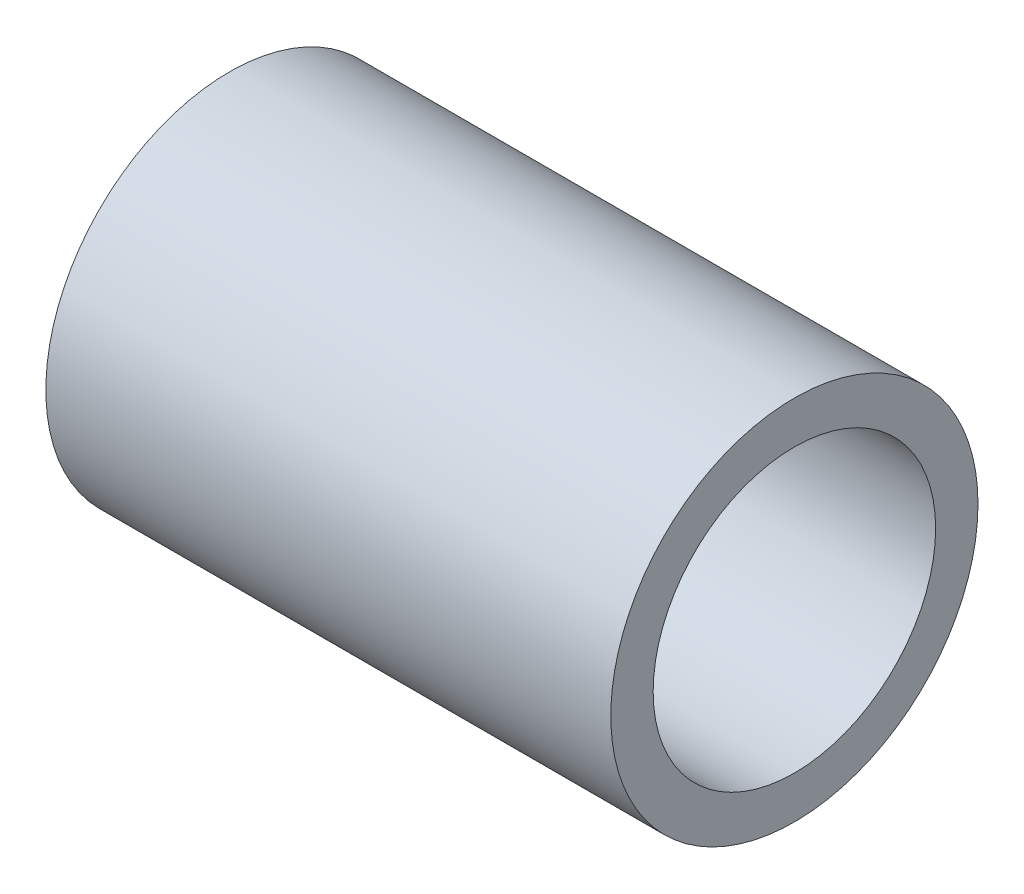
ISO-10303-21;
HEADER;
FILE_DESCRIPTION(('STEP AP214'),'2;1');
FILE_NAME('part.step','',(''),(''),'','','');
FILE_SCHEMA(('AUTOMOTIVE_DESIGN { 1 0 10303 214 1 1 1 1 }'));
ENDSEC;
DATA;
#1=APPLICATION_CONTEXT('core data for automotive mechanical design processes');
#2=APPLICATION_PROTOCOL_DEFINITION('international standard','automotive_design',2000,#1);
#3=PRODUCT_CONTEXT('',#1,'mechanical');
#4=PRODUCT('Part','Part','',(#3));
#5=PRODUCT_RELATED_PRODUCT_CATEGORY('part','',(#4));
#6=PRODUCT_DEFINITION_FORMATION('','',#4);
#7=PRODUCT_DEFINITION_CONTEXT('part definition',#1,'design');
#8=PRODUCT_DEFINITION('design','',#6,#7);
#9=PRODUCT_DEFINITION_SHAPE('','',#8);
#10=(LENGTH_UNIT() NAMED_UNIT(*) SI_UNIT(.MILLI.,.METRE.));
#11=(NAMED_UNIT(*) PLANE_ANGLE_UNIT() SI_UNIT($,.RADIAN.));
#12=(NAMED_UNIT(*) SI_UNIT($,.STERADIAN.) SOLID_ANGLE_UNIT());
#13=UNCERTAINTY_MEASURE_WITH_UNIT(LENGTH_MEASURE(1.E-05),#10,'distance_accuracy_value','');
#14=(GEOMETRIC_REPRESENTATION_CONTEXT(3) GLOBAL_UNCERTAINTY_ASSIGNED_CONTEXT((#13)) GLOBAL_UNIT_ASSIGNED_CONTEXT((#10,
#11,#12)) REPRESENTATION_CONTEXT('',''));
#15=CARTESIAN_POINT('',(0.,0.,0.));
#16=DIRECTION('',(0.,0.,1.));
#17=DIRECTION('',(1.,0.,0.));
#18=AXIS2_PLACEMENT_3D('',#15,#16,#17);
#19=CARTESIAN_POINT('',(20.,0.,0.));
#20=DIRECTION('',(1.,0.,0.));
#21=DIRECTION('',(0.,0.,-1.));
#22=AXIS2_PLACEMENT_3D('',#19,#20,#21);
#23=PLANE('',#22);
#24=CARTESIAN_POINT('',(20.,0.,0.));
#25=DIRECTION('',(1.,0.,0.));
#26=DIRECTION('',(0.,0.,-1.));
#27=AXIS2_PLACEMENT_3D('',#24,#25,#26);
#28=CIRCLE('',#27,6.5);
#29=CARTESIAN_POINT('',(20.,0.,-6.5));
#30=VERTEX_POINT('',#29);
#31=EDGE_CURVE('E10',#30,#30,#28,.T.);
#32=ORIENTED_EDGE('',*,*,#31,.T.);
#33=EDGE_LOOP('',(#32));
#34=FACE_BOUND('',#33,.T.);
#35=CARTESIAN_POINT('',(20.,0.,0.));
#36=DIRECTION('',(1.,0.,0.));
#37=DIRECTION('',(0.,0.,-1.));
#38=AXIS2_PLACEMENT_3D('',#35,#36,#37);
#39=CIRCLE('',#38,5.);
#40=CARTESIAN_POINT('',(20.,0.,-5.));
#41=VERTEX_POINT('',#40);
#42=EDGE_CURVE('E50',#41,#41,#39,.T.);
#43=ORIENTED_EDGE('',*,*,#42,.F.);
#44=EDGE_LOOP('',(#43));
#45=FACE_BOUND('',#44,.T.);
#46=ADVANCED_FACE('F38',(#34,#45),#23,.T.);
#47=CARTESIAN_POINT('',(0.,0.,0.));
#48=DIRECTION('',(1.,0.,0.));
#49=DIRECTION('',(0.,0.,-1.));
#50=AXIS2_PLACEMENT_3D('',#47,#48,#49);
#51=PLANE('',#50);
#52=CARTESIAN_POINT('',(0.,0.,0.));
#53=DIRECTION('',(1.,0.,0.));
#54=DIRECTION('',(0.,0.,-1.));
#55=AXIS2_PLACEMENT_3D('',#52,#53,#54);
#56=CIRCLE('',#55,6.5);
#57=CARTESIAN_POINT('',(0.,0.,-6.5));
#58=VERTEX_POINT('',#57);
#59=EDGE_CURVE('E37',#58,#58,#56,.T.);
#60=ORIENTED_EDGE('',*,*,#59,.F.);
#61=EDGE_LOOP('',(#60));
#62=FACE_BOUND('',#61,.T.);
#63=CARTESIAN_POINT('',(0.,0.,0.));
#64=DIRECTION('',(1.,0.,0.));
#65=DIRECTION('',(0.,0.,-1.));
#66=AXIS2_PLACEMENT_3D('',#63,#64,#65);
#67=CIRCLE('',#66,5.);
#68=CARTESIAN_POINT('',(0.,0.,-5.));
#69=VERTEX_POINT('',#68);
#70=EDGE_CURVE('E47',#69,#69,#67,.T.);
#71=ORIENTED_EDGE('',*,*,#70,.T.);
#72=EDGE_LOOP('',(#71));
#73=FACE_BOUND('',#72,.T.);
#74=ADVANCED_FACE('F56',(#62,#73),#51,.F.);
#75=CARTESIAN_POINT('',(20.,0.,0.));
#76=DIRECTION('',(-1.,0.,0.));
#77=DIRECTION('',(0.,0.,1.));
#78=AXIS2_PLACEMENT_3D('',#75,#76,#77);
#79=CYLINDRICAL_SURFACE('',#78,6.5);
#80=ORIENTED_EDGE('',*,*,#31,.F.);
#81=EDGE_LOOP('',(#80));
#82=FACE_BOUND('',#81,.T.);
#83=ORIENTED_EDGE('',*,*,#59,.T.);
#84=EDGE_LOOP('',(#83));
#85=FACE_BOUND('',#84,.T.);
#86=ADVANCED_FACE('F36',(#82,#85),#79,.T.);
#87=CARTESIAN_POINT('',(20.,0.,0.));
#88=DIRECTION('',(-1.,0.,0.));
#89=DIRECTION('',(0.,0.,1.));
#90=AXIS2_PLACEMENT_3D('',#87,#88,#89);
#91=CYLINDRICAL_SURFACE('',#90,5.);
#92=ORIENTED_EDGE('',*,*,#42,.T.);
#93=EDGE_LOOP('',(#92));
#94=FACE_BOUND('',#93,.T.);
#95=ORIENTED_EDGE('',*,*,#70,.F.);
#96=EDGE_LOOP('',(#95));
#97=FACE_BOUND('',#96,.T.);
#98=ADVANCED_FACE('F54',(#94,#97),#91,.F.);
#99=CLOSED_SHELL('',(#46,#74,#86,#98));
#100=MANIFOLD_SOLID_BREP('B2',#99);
#101=ADVANCED_BREP_SHAPE_REPRESENTATION('',(#18,#100),#14);
#102=SHAPE_DEFINITION_REPRESENTATION(#9,#101);
ENDSEC;
END-ISO-10303-21;
